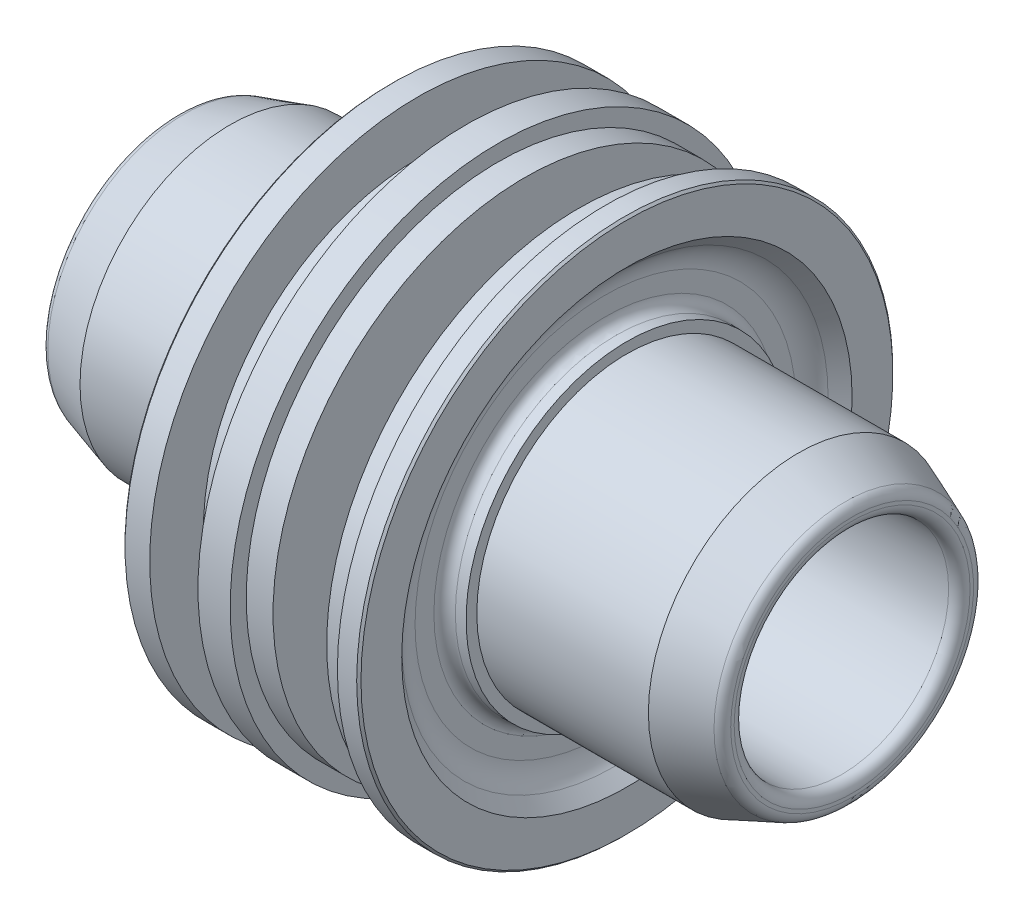
ISO-10303-21;
HEADER;
FILE_DESCRIPTION(('STEP AP214'),'2;1');
FILE_NAME('part.step','',(''),(''),'','','');
FILE_SCHEMA(('AUTOMOTIVE_DESIGN { 1 0 10303 214 1 1 1 1 }'));
ENDSEC;
DATA;
#1=APPLICATION_CONTEXT('core data for automotive mechanical design processes');
#2=APPLICATION_PROTOCOL_DEFINITION('international standard','automotive_design',2000,#1);
#3=PRODUCT_CONTEXT('',#1,'mechanical');
#4=PRODUCT('Part','Part','',(#3));
#5=PRODUCT_RELATED_PRODUCT_CATEGORY('part','',(#4));
#6=PRODUCT_DEFINITION_FORMATION('','',#4);
#7=PRODUCT_DEFINITION_CONTEXT('part definition',#1,'design');
#8=PRODUCT_DEFINITION('design','',#6,#7);
#9=PRODUCT_DEFINITION_SHAPE('','',#8);
#10=(LENGTH_UNIT() NAMED_UNIT(*) SI_UNIT(.MILLI.,.METRE.));
#11=(NAMED_UNIT(*) PLANE_ANGLE_UNIT() SI_UNIT($,.RADIAN.));
#12=(NAMED_UNIT(*) SI_UNIT($,.STERADIAN.) SOLID_ANGLE_UNIT());
#13=UNCERTAINTY_MEASURE_WITH_UNIT(LENGTH_MEASURE(1.E-05),#10,'distance_accuracy_value','');
#14=(GEOMETRIC_REPRESENTATION_CONTEXT(3) GLOBAL_UNCERTAINTY_ASSIGNED_CONTEXT((#13)) GLOBAL_UNIT_ASSIGNED_CONTEXT((#10,
#11,#12)) REPRESENTATION_CONTEXT('',''));
#15=CARTESIAN_POINT('',(0.,0.,0.));
#16=DIRECTION('',(0.,0.,1.));
#17=DIRECTION('',(1.,0.,0.));
#18=AXIS2_PLACEMENT_3D('',#15,#16,#17);
#19=CARTESIAN_POINT('',(25.,14.,0.));
#20=DIRECTION('',(-1.,0.,0.));
#21=DIRECTION('',(0.,0.,1.));
#22=AXIS2_PLACEMENT_3D('',#19,#20,#21);
#23=PLANE('',#22);
#24=CARTESIAN_POINT('',(25.,0.,0.));
#25=DIRECTION('',(-1.,0.,0.));
#26=DIRECTION('',(0.,0.,1.));
#27=AXIS2_PLACEMENT_3D('',#24,#25,#26);
#28=CIRCLE('',#27,14.);
#29=CARTESIAN_POINT('',(25.,0.,14.));
#30=VERTEX_POINT('',#29);
#31=EDGE_CURVE('E133',#30,#30,#28,.T.);
#32=ORIENTED_EDGE('',*,*,#31,.T.);
#33=EDGE_LOOP('',(#32));
#34=FACE_BOUND('',#33,.T.);
#35=CARTESIAN_POINT('',(25.,0.,0.));
#36=DIRECTION('',(1.,0.,0.));
#37=DIRECTION('',(0.,0.,-1.));
#38=AXIS2_PLACEMENT_3D('',#35,#36,#37);
#39=CIRCLE('',#38,15.);
#40=CARTESIAN_POINT('',(25.,0.,-15.));
#41=VERTEX_POINT('',#40);
#42=EDGE_CURVE('E187',#41,#41,#39,.T.);
#43=ORIENTED_EDGE('',*,*,#42,.T.);
#44=EDGE_LOOP('',(#43));
#45=FACE_BOUND('',#44,.T.);
#46=ADVANCED_FACE('F37',(#34,#45),#23,.F.);
#47=CARTESIAN_POINT('',(3.00000000000001,25.,0.));
#48=DIRECTION('',(1.,0.,0.));
#49=DIRECTION('',(0.,0.,-1.));
#50=AXIS2_PLACEMENT_3D('',#47,#48,#49);
#51=PLANE('',#50);
#52=CARTESIAN_POINT('',(3.00000000000001,0.,0.));
#53=DIRECTION('',(1.,0.,0.));
#54=DIRECTION('',(0.,0.,-1.));
#55=AXIS2_PLACEMENT_3D('',#52,#53,#54);
#56=CIRCLE('',#55,15.);
#57=CARTESIAN_POINT('',(3.00000000000001,0.,-15.));
#58=VERTEX_POINT('',#57);
#59=EDGE_CURVE('E142',#58,#58,#56,.T.);
#60=ORIENTED_EDGE('',*,*,#59,.F.);
#61=EDGE_LOOP('',(#60));
#62=FACE_BOUND('',#61,.T.);
#63=CARTESIAN_POINT('',(3.00000000000001,0.,0.));
#64=DIRECTION('',(-1.,0.,0.));
#65=DIRECTION('',(0.,0.,1.));
#66=AXIS2_PLACEMENT_3D('',#63,#64,#65);
#67=CIRCLE('',#66,14.);
#68=CARTESIAN_POINT('',(3.00000000000001,0.,14.));
#69=VERTEX_POINT('',#68);
#70=EDGE_CURVE('E136',#69,#69,#67,.T.);
#71=ORIENTED_EDGE('',*,*,#70,.F.);
#72=EDGE_LOOP('',(#71));
#73=FACE_BOUND('',#72,.T.);
#74=ADVANCED_FACE('F211',(#62,#73),#51,.F.);
#75=CARTESIAN_POINT('',(0.,10.,0.));
#76=DIRECTION('',(1.,0.,0.));
#77=DIRECTION('',(0.,0.,-1.));
#78=AXIS2_PLACEMENT_3D('',#75,#76,#77);
#79=PLANE('',#78);
#80=CARTESIAN_POINT('',(0.,0.,0.));
#81=DIRECTION('',(1.,0.,0.));
#82=DIRECTION('',(0.,0.,-1.));
#83=AXIS2_PLACEMENT_3D('',#80,#81,#82);
#84=CIRCLE('',#83,9.5);
#85=CARTESIAN_POINT('',(0.,0.,-9.5));
#86=VERTEX_POINT('',#85);
#87=EDGE_CURVE('E97',#86,#86,#84,.F.);
#88=ORIENTED_EDGE('',*,*,#87,.T.);
#89=EDGE_LOOP('',(#88));
#90=FACE_BOUND('',#89,.T.);
#91=CARTESIAN_POINT('',(0.,0.,0.));
#92=DIRECTION('',(-1.,0.,0.));
#93=DIRECTION('',(0.,0.,1.));
#94=AXIS2_PLACEMENT_3D('',#91,#92,#93);
#95=CIRCLE('',#94,6.);
#96=CARTESIAN_POINT('',(0.,0.,6.));
#97=VERTEX_POINT('',#96);
#98=EDGE_CURVE('E124',#97,#97,#95,.T.);
#99=ORIENTED_EDGE('',*,*,#98,.F.);
#100=EDGE_LOOP('',(#99));
#101=FACE_BOUND('',#100,.T.);
#102=ADVANCED_FACE('F219',(#90,#101),#79,.F.);
#103=CARTESIAN_POINT('',(-28.280163408719,0.,0.));
#104=DIRECTION('',(-1.,0.,0.));
#105=DIRECTION('',(0.,0.,1.));
#106=AXIS2_PLACEMENT_3D('',#103,#104,#105);
#107=CYLINDRICAL_SURFACE('',#106,6.);
#108=CARTESIAN_POINT('',(21.,0.,0.));
#109=DIRECTION('',(-1.,0.,0.));
#110=DIRECTION('',(0.,0.,1.));
#111=AXIS2_PLACEMENT_3D('',#108,#109,#110);
#112=CIRCLE('',#111,6.);
#113=CARTESIAN_POINT('',(21.,0.,6.));
#114=VERTEX_POINT('',#113);
#115=EDGE_CURVE('E127',#114,#114,#112,.T.);
#116=ORIENTED_EDGE('',*,*,#115,.F.);
#117=EDGE_LOOP('',(#116));
#118=FACE_BOUND('',#117,.T.);
#119=ORIENTED_EDGE('',*,*,#98,.T.);
#120=EDGE_LOOP('',(#119));
#121=FACE_BOUND('',#120,.T.);
#122=ADVANCED_FACE('F590',(#118,#121),#107,.F.);
#123=CARTESIAN_POINT('',(21.,6.,0.));
#124=DIRECTION('',(-1.,0.,0.));
#125=DIRECTION('',(0.,0.,1.));
#126=AXIS2_PLACEMENT_3D('',#123,#124,#125);
#127=PLANE('',#126);
#128=CARTESIAN_POINT('',(21.,0.,0.));
#129=DIRECTION('',(-1.,0.,0.));
#130=DIRECTION('',(0.,0.,1.));
#131=AXIS2_PLACEMENT_3D('',#128,#129,#130);
#132=CIRCLE('',#131,9.5);
#133=CARTESIAN_POINT('',(21.,0.,9.5));
#134=VERTEX_POINT('',#133);
#135=EDGE_CURVE('E88',#134,#134,#132,.F.);
#136=ORIENTED_EDGE('',*,*,#135,.T.);
#137=EDGE_LOOP('',(#136));
#138=FACE_BOUND('',#137,.T.);
#139=ORIENTED_EDGE('',*,*,#115,.T.);
#140=EDGE_LOOP('',(#139));
#141=FACE_BOUND('',#140,.T.);
#142=ADVANCED_FACE('F582',(#138,#141),#127,.F.);
#143=CARTESIAN_POINT('',(-28.280163408719,0.,0.));
#144=DIRECTION('',(-1.,0.,0.));
#145=DIRECTION('',(0.,0.,1.));
#146=AXIS2_PLACEMENT_3D('',#143,#144,#145);
#147=CYLINDRICAL_SURFACE('',#146,10.);
#148=CARTESIAN_POINT('',(21.5,0.,0.));
#149=DIRECTION('',(-1.,0.,0.));
#150=DIRECTION('',(0.,0.,1.));
#151=AXIS2_PLACEMENT_3D('',#148,#149,#150);
#152=CIRCLE('',#151,10.);
#153=CARTESIAN_POINT('',(21.5,0.,10.));
#154=VERTEX_POINT('',#153);
#155=EDGE_CURVE('E91',#154,#154,#152,.T.);
#156=ORIENTED_EDGE('',*,*,#155,.T.);
#157=EDGE_LOOP('',(#156));
#158=FACE_BOUND('',#157,.T.);
#159=CARTESIAN_POINT('',(45.,0.,0.));
#160=DIRECTION('',(-1.,0.,0.));
#161=DIRECTION('',(0.,0.,1.));
#162=AXIS2_PLACEMENT_3D('',#159,#160,#161);
#163=CIRCLE('',#162,10.);
#164=CARTESIAN_POINT('',(45.,0.,10.));
#165=VERTEX_POINT('',#164);
#166=EDGE_CURVE('E100',#165,#165,#163,.F.);
#167=ORIENTED_EDGE('',*,*,#166,.T.);
#168=EDGE_LOOP('',(#167));
#169=FACE_BOUND('',#168,.T.);
#170=ADVANCED_FACE('F575',(#158,#169),#147,.F.);
#171=CARTESIAN_POINT('',(46.,10.,0.));
#172=DIRECTION('',(-1.,0.,0.));
#173=DIRECTION('',(0.,0.,1.));
#174=AXIS2_PLACEMENT_3D('',#171,#172,#173);
#175=PLANE('',#174);
#176=CARTESIAN_POINT('',(46.,0.,0.));
#177=DIRECTION('',(-1.,0.,0.));
#178=DIRECTION('',(0.,0.,1.));
#179=AXIS2_PLACEMENT_3D('',#176,#177,#178);
#180=CIRCLE('',#179,11.3229670385731);
#181=CARTESIAN_POINT('',(46.,0.,11.3229670385731));
#182=VERTEX_POINT('',#181);
#183=EDGE_CURVE('E103',#182,#182,#180,.F.);
#184=ORIENTED_EDGE('',*,*,#183,.T.);
#185=EDGE_LOOP('',(#184));
#186=FACE_BOUND('',#185,.T.);
#187=CARTESIAN_POINT('',(46.,0.,0.));
#188=DIRECTION('',(-1.,0.,0.));
#189=DIRECTION('',(0.,0.,1.));
#190=AXIS2_PLACEMENT_3D('',#187,#188,#189);
#191=CIRCLE('',#190,11.);
#192=CARTESIAN_POINT('',(46.,0.,11.));
#193=VERTEX_POINT('',#192);
#194=EDGE_CURVE('E106',#193,#193,#191,.T.);
#195=ORIENTED_EDGE('',*,*,#194,.T.);
#196=EDGE_LOOP('',(#195));
#197=FACE_BOUND('',#196,.T.);
#198=ADVANCED_FACE('F568',(#186,#197),#175,.F.);
#199=CARTESIAN_POINT('',(46.,0.,0.));
#200=DIRECTION('',(-1.,0.,0.));
#201=DIRECTION('',(0.,0.,1.));
#202=AXIS2_PLACEMENT_3D('',#199,#200,#201);
#203=CONICAL_SURFACE('',#202,12.,0.380506377112365);
#204=CARTESIAN_POINT('',(45.3713906763541,0.,0.));
#205=DIRECTION('',(1.,0.,0.));
#206=DIRECTION('',(0.,0.,-1.));
#207=AXIS2_PLACEMENT_3D('',#204,#205,#206);
#208=CIRCLE('',#207,12.2514437294584);
#209=CARTESIAN_POINT('',(45.3713906763541,0.,-12.2514437294584));
#210=VERTEX_POINT('',#209);
#211=EDGE_CURVE('E109',#210,#210,#208,.F.);
#212=ORIENTED_EDGE('',*,*,#211,.T.);
#213=EDGE_LOOP('',(#212));
#214=FACE_BOUND('',#213,.T.);
#215=CARTESIAN_POINT('',(41.,0.,0.));
#216=DIRECTION('',(-1.,0.,0.));
#217=DIRECTION('',(0.,0.,1.));
#218=AXIS2_PLACEMENT_3D('',#215,#216,#217);
#219=CIRCLE('',#218,14.);
#220=CARTESIAN_POINT('',(41.,0.,14.));
#221=VERTEX_POINT('',#220);
#222=EDGE_CURVE('E130',#221,#221,#219,.T.);
#223=ORIENTED_EDGE('',*,*,#222,.F.);
#224=EDGE_LOOP('',(#223));
#225=FACE_BOUND('',#224,.T.);
#226=ADVANCED_FACE('F561',(#214,#225),#203,.T.);
#227=CARTESIAN_POINT('',(-28.280163408719,0.,0.));
#228=DIRECTION('',(-1.,0.,0.));
#229=DIRECTION('',(0.,0.,1.));
#230=AXIS2_PLACEMENT_3D('',#227,#228,#229);
#231=CYLINDRICAL_SURFACE('',#230,14.);
#232=ORIENTED_EDGE('',*,*,#31,.F.);
#233=EDGE_LOOP('',(#232));
#234=FACE_BOUND('',#233,.T.);
#235=ORIENTED_EDGE('',*,*,#222,.T.);
#236=EDGE_LOOP('',(#235));
#237=FACE_BOUND('',#236,.T.);
#238=ADVANCED_FACE('F312',(#234,#237),#231,.T.);
#239=CARTESIAN_POINT('',(-28.280163408719,0.,0.));
#240=DIRECTION('',(-1.,0.,0.));
#241=DIRECTION('',(0.,0.,1.));
#242=AXIS2_PLACEMENT_3D('',#239,#240,#241);
#243=CYLINDRICAL_SURFACE('',#242,14.);
#244=CARTESIAN_POINT('',(-12.,0.,0.));
#245=DIRECTION('',(-1.,0.,0.));
#246=DIRECTION('',(0.,0.,1.));
#247=AXIS2_PLACEMENT_3D('',#244,#245,#246);
#248=CIRCLE('',#247,14.);
#249=CARTESIAN_POINT('',(-12.,0.,14.));
#250=VERTEX_POINT('',#249);
#251=EDGE_CURVE('E139',#250,#250,#248,.T.);
#252=ORIENTED_EDGE('',*,*,#251,.F.);
#253=EDGE_LOOP('',(#252));
#254=FACE_BOUND('',#253,.T.);
#255=ORIENTED_EDGE('',*,*,#70,.T.);
#256=EDGE_LOOP('',(#255));
#257=FACE_BOUND('',#256,.T.);
#258=ADVANCED_FACE('F309',(#254,#257),#243,.T.);
#259=CARTESIAN_POINT('',(-12.,0.,0.));
#260=DIRECTION('',(1.,0.,0.));
#261=DIRECTION('',(0.,0.,-1.));
#262=AXIS2_PLACEMENT_3D('',#259,#260,#261);
#263=CONICAL_SURFACE('',#262,14.,0.291456794477867);
#264=CARTESIAN_POINT('',(-16.2873478855663,0.,0.));
#265=DIRECTION('',(-1.,0.,0.));
#266=DIRECTION('',(0.,0.,1.));
#267=AXIS2_PLACEMENT_3D('',#264,#265,#266);
#268=CIRCLE('',#267,12.7137956343301);
#269=CARTESIAN_POINT('',(-16.2873478855663,0.,12.7137956343301));
#270=VERTEX_POINT('',#269);
#271=EDGE_CURVE('E115',#270,#270,#268,.F.);
#272=ORIENTED_EDGE('',*,*,#271,.T.);
#273=EDGE_LOOP('',(#272));
#274=FACE_BOUND('',#273,.T.);
#275=ORIENTED_EDGE('',*,*,#251,.T.);
#276=EDGE_LOOP('',(#275));
#277=FACE_BOUND('',#276,.T.);
#278=ADVANCED_FACE('F311',(#274,#277),#263,.T.);
#279=CARTESIAN_POINT('',(-17.,12.5,0.));
#280=DIRECTION('',(1.,0.,0.));
#281=DIRECTION('',(0.,0.,-1.));
#282=AXIS2_PLACEMENT_3D('',#279,#280,#281);
#283=PLANE('',#282);
#284=CARTESIAN_POINT('',(-17.,0.,0.));
#285=DIRECTION('',(1.,0.,0.));
#286=DIRECTION('',(0.,0.,-1.));
#287=AXIS2_PLACEMENT_3D('',#284,#285,#286);
#288=CIRCLE('',#287,11.7559693491089);
#289=CARTESIAN_POINT('',(-17.,0.,-11.7559693491089));
#290=VERTEX_POINT('',#289);
#291=EDGE_CURVE('E118',#290,#290,#288,.F.);
#292=ORIENTED_EDGE('',*,*,#291,.T.);
#293=EDGE_LOOP('',(#292));
#294=FACE_BOUND('',#293,.T.);
#295=CARTESIAN_POINT('',(-17.,0.,0.));
#296=DIRECTION('',(1.,0.,0.));
#297=DIRECTION('',(0.,0.,-1.));
#298=AXIS2_PLACEMENT_3D('',#295,#296,#297);
#299=CIRCLE('',#298,11.);
#300=CARTESIAN_POINT('',(-17.,0.,-11.));
#301=VERTEX_POINT('',#300);
#302=EDGE_CURVE('E121',#301,#301,#299,.T.);
#303=ORIENTED_EDGE('',*,*,#302,.T.);
#304=EDGE_LOOP('',(#303));
#305=FACE_BOUND('',#304,.T.);
#306=ADVANCED_FACE('F316',(#294,#305),#283,.F.);
#307=CARTESIAN_POINT('',(-28.280163408719,0.,0.));
#308=DIRECTION('',(-1.,0.,0.));
#309=DIRECTION('',(0.,0.,1.));
#310=AXIS2_PLACEMENT_3D('',#307,#308,#309);
#311=CYLINDRICAL_SURFACE('',#310,10.);
#312=CARTESIAN_POINT('',(-0.5,0.,0.));
#313=DIRECTION('',(1.,0.,0.));
#314=DIRECTION('',(0.,0.,-1.));
#315=AXIS2_PLACEMENT_3D('',#312,#313,#314);
#316=CIRCLE('',#315,10.);
#317=CARTESIAN_POINT('',(-0.5,0.,-10.));
#318=VERTEX_POINT('',#317);
#319=EDGE_CURVE('E94',#318,#318,#316,.T.);
#320=ORIENTED_EDGE('',*,*,#319,.T.);
#321=EDGE_LOOP('',(#320));
#322=FACE_BOUND('',#321,.T.);
#323=CARTESIAN_POINT('',(-16.,0.,0.));
#324=DIRECTION('',(1.,0.,0.));
#325=DIRECTION('',(0.,0.,-1.));
#326=AXIS2_PLACEMENT_3D('',#323,#324,#325);
#327=CIRCLE('',#326,10.);
#328=CARTESIAN_POINT('',(-16.,0.,-10.));
#329=VERTEX_POINT('',#328);
#330=EDGE_CURVE('E112',#329,#329,#327,.F.);
#331=ORIENTED_EDGE('',*,*,#330,.T.);
#332=EDGE_LOOP('',(#331));
#333=FACE_BOUND('',#332,.T.);
#334=ADVANCED_FACE('F320',(#322,#333),#311,.F.);
#335=CARTESIAN_POINT('',(25.,0.,0.));
#336=DIRECTION('',(1.,0.,0.));
#337=DIRECTION('',(0.,0.,-1.));
#338=AXIS2_PLACEMENT_3D('',#335,#336,#337);
#339=CYLINDRICAL_SURFACE('',#338,15.);
#340=CARTESIAN_POINT('',(9.85698146746236,0.,0.));
#341=DIRECTION('',(1.,0.,0.));
#342=DIRECTION('',(0.,0.,-1.));
#343=AXIS2_PLACEMENT_3D('',#340,#341,#342);
#344=CIRCLE('',#343,15.);
#345=CARTESIAN_POINT('',(9.85698146746236,0.,-15.));
#346=VERTEX_POINT('',#345);
#347=EDGE_CURVE('E58',#346,#346,#344,.F.);
#348=ORIENTED_EDGE('',*,*,#347,.T.);
#349=EDGE_LOOP('',(#348));
#350=FACE_BOUND('',#349,.T.);
#351=ORIENTED_EDGE('',*,*,#59,.T.);
#352=EDGE_LOOP('',(#351));
#353=FACE_BOUND('',#352,.T.);
#354=ADVANCED_FACE('F324',(#350,#353),#339,.T.);
#355=CARTESIAN_POINT('',(10.5,0.,0.));
#356=DIRECTION('',(-1.,0.,0.));
#357=DIRECTION('',(0.,0.,1.));
#358=AXIS2_PLACEMENT_3D('',#355,#356,#357);
#359=CONICAL_SURFACE('',#358,15.,1.32184304977876);
#360=CARTESIAN_POINT('',(10.0014833152142,0.,0.));
#361=DIRECTION('',(-1.,0.,0.));
#362=DIRECTION('',(0.,0.,1.));
#363=AXIS2_PLACEMENT_3D('',#360,#361,#362);
#364=CIRCLE('',#363,16.9609097172133);
#365=CARTESIAN_POINT('',(10.0014833152142,0.,16.9609097172133));
#366=VERTEX_POINT('',#365);
#367=EDGE_CURVE('E61',#366,#366,#364,.T.);
#368=ORIENTED_EDGE('',*,*,#367,.T.);
#369=EDGE_LOOP('',(#368));
#370=FACE_BOUND('',#369,.T.);
#371=CARTESIAN_POINT('',(10.3415668946072,0.,0.));
#372=DIRECTION('',(-1.,0.,0.));
#373=DIRECTION('',(0.,0.,1.));
#374=AXIS2_PLACEMENT_3D('',#371,#372,#373);
#375=CIRCLE('',#374,15.6231948205036);
#376=CARTESIAN_POINT('',(10.3415668946072,0.,15.6231948205036));
#377=VERTEX_POINT('',#376);
#378=EDGE_CURVE('E64',#377,#377,#375,.F.);
#379=ORIENTED_EDGE('',*,*,#378,.T.);
#380=EDGE_LOOP('',(#379));
#381=FACE_BOUND('',#380,.T.);
#382=ADVANCED_FACE('F328',(#370,#381),#359,.F.);
#383=CARTESIAN_POINT('',(9.93465244547025,0.,0.));
#384=DIRECTION('',(-1.,0.,0.));
#385=DIRECTION('',(0.,0.,1.));
#386=AXIS2_PLACEMENT_3D('',#383,#384,#385);
#387=CONICAL_SURFACE('',#386,17.2237881842539,0.327738506780553);
#388=CARTESIAN_POINT('',(8.40098777313008,0.,0.));
#389=DIRECTION('',(-1.,0.,0.));
#390=DIRECTION('',(0.,0.,1.));
#391=AXIS2_PLACEMENT_3D('',#388,#389,#390);
#392=CIRCLE('',#391,17.7452341728495);
#393=CARTESIAN_POINT('',(8.40098777313008,0.,17.7452341728495));
#394=VERTEX_POINT('',#393);
#395=EDGE_CURVE('E67',#394,#394,#392,.T.);
#396=ORIENTED_EDGE('',*,*,#395,.T.);
#397=EDGE_LOOP('',(#396));
#398=FACE_BOUND('',#397,.T.);
#399=CARTESIAN_POINT('',(9.67784925468872,0.,0.));
#400=DIRECTION('',(-1.,0.,0.));
#401=DIRECTION('',(0.,0.,1.));
#402=AXIS2_PLACEMENT_3D('',#399,#400,#401);
#403=CIRCLE('',#402,17.3111012691196);
#404=CARTESIAN_POINT('',(9.67784925468872,0.,17.3111012691196));
#405=VERTEX_POINT('',#404);
#406=EDGE_CURVE('E70',#405,#405,#403,.F.);
#407=ORIENTED_EDGE('',*,*,#406,.T.);
#408=EDGE_LOOP('',(#407));
#409=FACE_BOUND('',#408,.T.);
#410=ADVANCED_FACE('F332',(#398,#409),#387,.F.);
#411=CARTESIAN_POINT('',(8.3332351781665,0.,0.));
#412=DIRECTION('',(-1.,0.,0.));
#413=DIRECTION('',(0.,0.,1.));
#414=AXIS2_PLACEMENT_3D('',#411,#412,#413);
#415=CONICAL_SURFACE('',#414,17.7682700551371,0.0434228518228207);
#416=CARTESIAN_POINT('',(8.26174101009033,0.,0.));
#417=DIRECTION('',(-1.,0.,0.));
#418=DIRECTION('',(0.,0.,1.));
#419=AXIS2_PLACEMENT_3D('',#416,#417,#418);
#420=CIRCLE('',#419,17.7713764884882);
#421=CARTESIAN_POINT('',(8.26174101009033,0.,17.7713764884882));
#422=VERTEX_POINT('',#421);
#423=EDGE_CURVE('E73',#422,#422,#420,.F.);
#424=ORIENTED_EDGE('',*,*,#423,.T.);
#425=EDGE_LOOP('',(#424));
#426=FACE_BOUND('',#425,.T.);
#427=CARTESIAN_POINT('',(3.00000000000001,0.,0.));
#428=DIRECTION('',(1.,0.,0.));
#429=DIRECTION('',(0.,0.,-1.));
#430=AXIS2_PLACEMENT_3D('',#427,#428,#429);
#431=CIRCLE('',#430,18.);
#432=CARTESIAN_POINT('',(3.00000000000001,0.,-18.));
#433=VERTEX_POINT('',#432);
#434=EDGE_CURVE('E145',#433,#433,#431,.T.);
#435=ORIENTED_EDGE('',*,*,#434,.F.);
#436=EDGE_LOOP('',(#435));
#437=FACE_BOUND('',#436,.T.);
#438=ADVANCED_FACE('F207',(#426,#437),#415,.F.);
#439=CARTESIAN_POINT('',(25.,0.,0.));
#440=DIRECTION('',(1.,0.,0.));
#441=DIRECTION('',(0.,0.,-1.));
#442=AXIS2_PLACEMENT_3D('',#439,#440,#441);
#443=CONICAL_SURFACE('',#442,21.,0.785398163397447);
#444=CARTESIAN_POINT('',(23.8786796564404,0.,0.));
#445=DIRECTION('',(1.,0.,0.));
#446=DIRECTION('',(0.,0.,-1.));
#447=AXIS2_PLACEMENT_3D('',#444,#445,#446);
#448=CIRCLE('',#447,19.8786796564404);
#449=CARTESIAN_POINT('',(23.8786796564404,0.,-19.8786796564404));
#450=VERTEX_POINT('',#449);
#451=EDGE_CURVE('E76',#450,#450,#448,.F.);
#452=ORIENTED_EDGE('',*,*,#451,.T.);
#453=EDGE_LOOP('',(#452));
#454=FACE_BOUND('',#453,.T.);
#455=CARTESIAN_POINT('',(25.,0.,0.));
#456=DIRECTION('',(1.,0.,0.));
#457=DIRECTION('',(0.,0.,-1.));
#458=AXIS2_PLACEMENT_3D('',#455,#456,#457);
#459=CIRCLE('',#458,21.);
#460=CARTESIAN_POINT('',(25.,0.,-21.));
#461=VERTEX_POINT('',#460);
#462=EDGE_CURVE('E174',#461,#461,#459,.T.);
#463=ORIENTED_EDGE('',*,*,#462,.T.);
#464=EDGE_LOOP('',(#463));
#465=FACE_BOUND('',#464,.T.);
#466=ADVANCED_FACE('F195',(#454,#465),#443,.F.);
#467=CARTESIAN_POINT('',(25.,0.,0.));
#468=DIRECTION('',(1.,0.,0.));
#469=DIRECTION('',(0.,0.,-1.));
#470=AXIS2_PLACEMENT_3D('',#467,#468,#469);
#471=CYLINDRICAL_SURFACE('',#470,15.);
#472=CARTESIAN_POINT('',(24.,0.,0.));
#473=DIRECTION('',(-1.,0.,0.));
#474=DIRECTION('',(0.,0.,1.));
#475=AXIS2_PLACEMENT_3D('',#472,#473,#474);
#476=CIRCLE('',#475,15.);
#477=CARTESIAN_POINT('',(24.,0.,15.));
#478=VERTEX_POINT('',#477);
#479=EDGE_CURVE('E85',#478,#478,#476,.F.);
#480=ORIENTED_EDGE('',*,*,#479,.T.);
#481=EDGE_LOOP('',(#480));
#482=FACE_BOUND('',#481,.T.);
#483=ORIENTED_EDGE('',*,*,#42,.F.);
#484=EDGE_LOOP('',(#483));
#485=FACE_BOUND('',#484,.T.);
#486=ADVANCED_FACE('F192',(#482,#485),#471,.T.);
#487=CARTESIAN_POINT('',(23.,15.,0.));
#488=DIRECTION('',(-1.,0.,0.));
#489=DIRECTION('',(0.,0.,1.));
#490=AXIS2_PLACEMENT_3D('',#487,#488,#489);
#491=PLANE('',#490);
#492=CARTESIAN_POINT('',(23.,0.,0.));
#493=DIRECTION('',(-1.,0.,0.));
#494=DIRECTION('',(0.,0.,1.));
#495=AXIS2_PLACEMENT_3D('',#492,#493,#494);
#496=CIRCLE('',#495,17.7573593128807);
#497=CARTESIAN_POINT('',(23.,0.,17.7573593128807));
#498=VERTEX_POINT('',#497);
#499=EDGE_CURVE('E79',#498,#498,#496,.F.);
#500=ORIENTED_EDGE('',*,*,#499,.T.);
#501=EDGE_LOOP('',(#500));
#502=FACE_BOUND('',#501,.T.);
#503=CARTESIAN_POINT('',(23.,0.,0.));
#504=DIRECTION('',(-1.,0.,0.));
#505=DIRECTION('',(0.,0.,1.));
#506=AXIS2_PLACEMENT_3D('',#503,#504,#505);
#507=CIRCLE('',#506,16.);
#508=CARTESIAN_POINT('',(23.,0.,16.));
#509=VERTEX_POINT('',#508);
#510=EDGE_CURVE('E82',#509,#509,#507,.T.);
#511=ORIENTED_EDGE('',*,*,#510,.T.);
#512=EDGE_LOOP('',(#511));
#513=FACE_BOUND('',#512,.T.);
#514=ADVANCED_FACE('F194',(#502,#513),#491,.F.);
#515=CARTESIAN_POINT('',(3.00000000000001,0.,0.));
#516=DIRECTION('',(1.,0.,0.));
#517=DIRECTION('',(0.,0.,-1.));
#518=AXIS2_PLACEMENT_3D('',#515,#516,#517);
#519=CIRCLE('',#518,24.8);
#520=CARTESIAN_POINT('',(3.00000000000001,0.,-24.8));
#521=VERTEX_POINT('',#520);
#522=EDGE_CURVE('E45',#521,#521,#519,.F.);
#523=ORIENTED_EDGE('',*,*,#522,.T.);
#524=EDGE_LOOP('',(#523));
#525=FACE_BOUND('',#524,.T.);
#526=ORIENTED_EDGE('',*,*,#434,.T.);
#527=EDGE_LOOP('',(#526));
#528=FACE_BOUND('',#527,.T.);
#529=ADVANCED_FACE('F203',(#525,#528),#51,.F.);
#530=CARTESIAN_POINT('',(-28.280163408719,0.,0.));
#531=DIRECTION('',(-1.,0.,0.));
#532=DIRECTION('',(0.,0.,1.));
#533=AXIS2_PLACEMENT_3D('',#530,#531,#532);
#534=CYLINDRICAL_SURFACE('',#533,25.);
#535=CARTESIAN_POINT('',(3.20000000000003,0.,0.));
#536=DIRECTION('',(1.,0.,0.));
#537=DIRECTION('',(0.,0.,-1.));
#538=AXIS2_PLACEMENT_3D('',#535,#536,#537);
#539=CIRCLE('',#538,25.);
#540=CARTESIAN_POINT('',(3.20000000000003,0.,-25.));
#541=VERTEX_POINT('',#540);
#542=EDGE_CURVE('E10',#541,#541,#539,.T.);
#543=ORIENTED_EDGE('',*,*,#542,.T.);
#544=EDGE_LOOP('',(#543));
#545=FACE_BOUND('',#544,.T.);
#546=CARTESIAN_POINT('',(5.50000000000001,0.,0.));
#547=DIRECTION('',(1.,0.,0.));
#548=DIRECTION('',(0.,0.,-1.));
#549=AXIS2_PLACEMENT_3D('',#546,#547,#548);
#550=CIRCLE('',#549,25.);
#551=CARTESIAN_POINT('',(5.50000000000001,0.,-25.));
#552=VERTEX_POINT('',#551);
#553=EDGE_CURVE('E152',#552,#552,#550,.T.);
#554=ORIENTED_EDGE('',*,*,#553,.F.);
#555=EDGE_LOOP('',(#554));
#556=FACE_BOUND('',#555,.T.);
#557=ADVANCED_FACE('F236',(#545,#556),#534,.T.);
#558=CARTESIAN_POINT('',(24.8,0.,0.));
#559=DIRECTION('',(-1.,0.,0.));
#560=DIRECTION('',(0.,0.,1.));
#561=AXIS2_PLACEMENT_3D('',#558,#559,#560);
#562=CIRCLE('',#561,25.);
#563=CARTESIAN_POINT('',(24.8,0.,25.));
#564=VERTEX_POINT('',#563);
#565=EDGE_CURVE('E53',#564,#564,#562,.T.);
#566=ORIENTED_EDGE('',*,*,#565,.T.);
#567=EDGE_LOOP('',(#566));
#568=FACE_BOUND('',#567,.T.);
#569=CARTESIAN_POINT('',(23.,0.,0.));
#570=DIRECTION('',(1.,0.,0.));
#571=DIRECTION('',(0.,0.,-1.));
#572=AXIS2_PLACEMENT_3D('',#569,#570,#571);
#573=CIRCLE('',#572,25.);
#574=CARTESIAN_POINT('',(23.,0.,-25.));
#575=VERTEX_POINT('',#574);
#576=EDGE_CURVE('E168',#575,#575,#573,.T.);
#577=ORIENTED_EDGE('',*,*,#576,.T.);
#578=EDGE_LOOP('',(#577));
#579=FACE_BOUND('',#578,.T.);
#580=ADVANCED_FACE('F226',(#568,#579),#534,.T.);
#581=CARTESIAN_POINT('',(25.,0.,0.));
#582=DIRECTION('',(-1.,0.,0.));
#583=DIRECTION('',(0.,0.,1.));
#584=AXIS2_PLACEMENT_3D('',#581,#582,#583);
#585=CIRCLE('',#584,24.8);
#586=CARTESIAN_POINT('',(25.,0.,24.8));
#587=VERTEX_POINT('',#586);
#588=EDGE_CURVE('E49',#587,#587,#585,.F.);
#589=ORIENTED_EDGE('',*,*,#588,.T.);
#590=EDGE_LOOP('',(#589));
#591=FACE_BOUND('',#590,.T.);
#592=ORIENTED_EDGE('',*,*,#462,.F.);
#593=EDGE_LOOP('',(#592));
#594=FACE_BOUND('',#593,.T.);
#595=ADVANCED_FACE('F214',(#591,#594),#23,.F.);
#596=CARTESIAN_POINT('',(13.,25.,0.));
#597=DIRECTION('',(-1.,0.,0.));
#598=DIRECTION('',(0.,0.,1.));
#599=AXIS2_PLACEMENT_3D('',#596,#597,#598);
#600=PLANE('',#599);
#601=CARTESIAN_POINT('',(13.,0.,0.));
#602=DIRECTION('',(1.,0.,0.));
#603=DIRECTION('',(0.,0.,-1.));
#604=AXIS2_PLACEMENT_3D('',#601,#602,#603);
#605=CIRCLE('',#604,23.5);
#606=CARTESIAN_POINT('',(13.,0.,-23.5));
#607=VERTEX_POINT('',#606);
#608=EDGE_CURVE('E149',#607,#607,#605,.T.);
#609=ORIENTED_EDGE('',*,*,#608,.F.);
#610=EDGE_LOOP('',(#609));
#611=FACE_BOUND('',#610,.T.);
#612=CARTESIAN_POINT('',(13.,0.,0.));
#613=DIRECTION('',(1.,0.,0.));
#614=DIRECTION('',(0.,0.,-1.));
#615=AXIS2_PLACEMENT_3D('',#612,#613,#614);
#616=CIRCLE('',#615,25.);
#617=CARTESIAN_POINT('',(13.,0.,-25.));
#618=VERTEX_POINT('',#617);
#619=EDGE_CURVE('E171',#618,#618,#616,.T.);
#620=ORIENTED_EDGE('',*,*,#619,.T.);
#621=EDGE_LOOP('',(#620));
#622=FACE_BOUND('',#621,.T.);
#623=ADVANCED_FACE('F225',(#611,#622),#600,.F.);
#624=CARTESIAN_POINT('',(25.,0.,0.));
#625=DIRECTION('',(1.,0.,0.));
#626=DIRECTION('',(0.,0.,-1.));
#627=AXIS2_PLACEMENT_3D('',#624,#625,#626);
#628=CYLINDRICAL_SURFACE('',#627,23.5);
#629=CARTESIAN_POINT('',(15.5,0.,0.));
#630=DIRECTION('',(1.,0.,0.));
#631=DIRECTION('',(0.,0.,-1.));
#632=AXIS2_PLACEMENT_3D('',#629,#630,#631);
#633=CIRCLE('',#632,23.5);
#634=CARTESIAN_POINT('',(15.5,0.,-23.5));
#635=VERTEX_POINT('',#634);
#636=EDGE_CURVE('E153',#635,#635,#633,.T.);
#637=ORIENTED_EDGE('',*,*,#636,.F.);
#638=EDGE_LOOP('',(#637));
#639=FACE_BOUND('',#638,.T.);
#640=ORIENTED_EDGE('',*,*,#608,.T.);
#641=EDGE_LOOP('',(#640));
#642=FACE_BOUND('',#641,.T.);
#643=ADVANCED_FACE('F233',(#639,#642),#628,.T.);
#644=CARTESIAN_POINT('',(15.5,23.5,0.));
#645=DIRECTION('',(-1.,0.,0.));
#646=DIRECTION('',(0.,0.,1.));
#647=AXIS2_PLACEMENT_3D('',#644,#645,#646);
#648=PLANE('',#647);
#649=CARTESIAN_POINT('',(15.5,0.,0.));
#650=DIRECTION('',(1.,0.,0.));
#651=DIRECTION('',(0.,0.,-1.));
#652=AXIS2_PLACEMENT_3D('',#649,#650,#651);
#653=CIRCLE('',#652,15.);
#654=CARTESIAN_POINT('',(15.5,0.,-15.));
#655=VERTEX_POINT('',#654);
#656=EDGE_CURVE('E156',#655,#655,#653,.T.);
#657=ORIENTED_EDGE('',*,*,#656,.F.);
#658=EDGE_LOOP('',(#657));
#659=FACE_BOUND('',#658,.T.);
#660=ORIENTED_EDGE('',*,*,#636,.T.);
#661=EDGE_LOOP('',(#660));
#662=FACE_BOUND('',#661,.T.);
#663=ADVANCED_FACE('F272',(#659,#662),#648,.F.);
#664=CARTESIAN_POINT('',(25.,0.,0.));
#665=DIRECTION('',(1.,0.,0.));
#666=DIRECTION('',(0.,0.,-1.));
#667=AXIS2_PLACEMENT_3D('',#664,#665,#666);
#668=CYLINDRICAL_SURFACE('',#667,15.);
#669=CARTESIAN_POINT('',(20.5,0.,0.));
#670=DIRECTION('',(1.,0.,0.));
#671=DIRECTION('',(0.,0.,-1.));
#672=AXIS2_PLACEMENT_3D('',#669,#670,#671);
#673=CIRCLE('',#672,15.);
#674=CARTESIAN_POINT('',(20.5,0.,-15.));
#675=VERTEX_POINT('',#674);
#676=EDGE_CURVE('E159',#675,#675,#673,.T.);
#677=ORIENTED_EDGE('',*,*,#676,.F.);
#678=EDGE_LOOP('',(#677));
#679=FACE_BOUND('',#678,.T.);
#680=ORIENTED_EDGE('',*,*,#656,.T.);
#681=EDGE_LOOP('',(#680));
#682=FACE_BOUND('',#681,.T.);
#683=ADVANCED_FACE('F266',(#679,#682),#668,.T.);
#684=CARTESIAN_POINT('',(20.5,23.5,0.));
#685=DIRECTION('',(1.,0.,0.));
#686=DIRECTION('',(0.,0.,-1.));
#687=AXIS2_PLACEMENT_3D('',#684,#685,#686);
#688=PLANE('',#687);
#689=CARTESIAN_POINT('',(20.5,0.,0.));
#690=DIRECTION('',(1.,0.,0.));
#691=DIRECTION('',(0.,0.,-1.));
#692=AXIS2_PLACEMENT_3D('',#689,#690,#691);
#693=CIRCLE('',#692,23.5);
#694=CARTESIAN_POINT('',(20.5,0.,-23.5));
#695=VERTEX_POINT('',#694);
#696=EDGE_CURVE('E162',#695,#695,#693,.T.);
#697=ORIENTED_EDGE('',*,*,#696,.F.);
#698=EDGE_LOOP('',(#697));
#699=FACE_BOUND('',#698,.T.);
#700=ORIENTED_EDGE('',*,*,#676,.T.);
#701=EDGE_LOOP('',(#700));
#702=FACE_BOUND('',#701,.T.);
#703=ADVANCED_FACE('F260',(#699,#702),#688,.F.);
#704=CARTESIAN_POINT('',(25.,0.,0.));
#705=DIRECTION('',(1.,0.,0.));
#706=DIRECTION('',(0.,0.,-1.));
#707=AXIS2_PLACEMENT_3D('',#704,#705,#706);
#708=CYLINDRICAL_SURFACE('',#707,23.5);
#709=CARTESIAN_POINT('',(23.,0.,0.));
#710=DIRECTION('',(1.,0.,0.));
#711=DIRECTION('',(0.,0.,-1.));
#712=AXIS2_PLACEMENT_3D('',#709,#710,#711);
#713=CIRCLE('',#712,23.5);
#714=CARTESIAN_POINT('',(23.,0.,-23.5));
#715=VERTEX_POINT('',#714);
#716=EDGE_CURVE('E165',#715,#715,#713,.T.);
#717=ORIENTED_EDGE('',*,*,#716,.F.);
#718=EDGE_LOOP('',(#717));
#719=FACE_BOUND('',#718,.T.);
#720=ORIENTED_EDGE('',*,*,#696,.T.);
#721=EDGE_LOOP('',(#720));
#722=FACE_BOUND('',#721,.T.);
#723=ADVANCED_FACE('F254',(#719,#722),#708,.T.);
#724=CARTESIAN_POINT('',(23.,25.,0.));
#725=DIRECTION('',(1.,0.,0.));
#726=DIRECTION('',(0.,0.,-1.));
#727=AXIS2_PLACEMENT_3D('',#724,#725,#726);
#728=PLANE('',#727);
#729=ORIENTED_EDGE('',*,*,#576,.F.);
#730=EDGE_LOOP('',(#729));
#731=FACE_BOUND('',#730,.T.);
#732=ORIENTED_EDGE('',*,*,#716,.T.);
#733=EDGE_LOOP('',(#732));
#734=FACE_BOUND('',#733,.T.);
#735=ADVANCED_FACE('F251',(#731,#734),#728,.F.);
#736=CARTESIAN_POINT('',(10.,0.,0.));
#737=DIRECTION('',(1.,0.,0.));
#738=DIRECTION('',(0.,0.,-1.));
#739=AXIS2_PLACEMENT_3D('',#736,#737,#738);
#740=CIRCLE('',#739,25.);
#741=CARTESIAN_POINT('',(10.,0.,-25.));
#742=VERTEX_POINT('',#741);
#743=EDGE_CURVE('E180',#742,#742,#740,.T.);
#744=ORIENTED_EDGE('',*,*,#743,.T.);
#745=EDGE_LOOP('',(#744));
#746=FACE_BOUND('',#745,.T.);
#747=ORIENTED_EDGE('',*,*,#619,.F.);
#748=EDGE_LOOP('',(#747));
#749=FACE_BOUND('',#748,.T.);
#750=ADVANCED_FACE('F238',(#746,#749),#534,.T.);
#751=CARTESIAN_POINT('',(5.50000000000001,25.,0.));
#752=DIRECTION('',(-1.,0.,0.));
#753=DIRECTION('',(0.,0.,1.));
#754=AXIS2_PLACEMENT_3D('',#751,#752,#753);
#755=PLANE('',#754);
#756=CARTESIAN_POINT('',(5.50000000000001,0.,0.));
#757=DIRECTION('',(1.,0.,0.));
#758=DIRECTION('',(0.,0.,-1.));
#759=AXIS2_PLACEMENT_3D('',#756,#757,#758);
#760=CIRCLE('',#759,20.);
#761=CARTESIAN_POINT('',(5.50000000000001,0.,-20.));
#762=VERTEX_POINT('',#761);
#763=EDGE_CURVE('E148',#762,#762,#760,.T.);
#764=ORIENTED_EDGE('',*,*,#763,.F.);
#765=EDGE_LOOP('',(#764));
#766=FACE_BOUND('',#765,.T.);
#767=ORIENTED_EDGE('',*,*,#553,.T.);
#768=EDGE_LOOP('',(#767));
#769=FACE_BOUND('',#768,.T.);
#770=ADVANCED_FACE('F289',(#766,#769),#755,.F.);
#771=CARTESIAN_POINT('',(25.,0.,0.));
#772=DIRECTION('',(1.,0.,0.));
#773=DIRECTION('',(0.,0.,-1.));
#774=AXIS2_PLACEMENT_3D('',#771,#772,#773);
#775=CYLINDRICAL_SURFACE('',#774,20.);
#776=CARTESIAN_POINT('',(10.,0.,0.));
#777=DIRECTION('',(1.,0.,0.));
#778=DIRECTION('',(0.,0.,-1.));
#779=AXIS2_PLACEMENT_3D('',#776,#777,#778);
#780=CIRCLE('',#779,20.);
#781=CARTESIAN_POINT('',(10.,0.,-20.));
#782=VERTEX_POINT('',#781);
#783=EDGE_CURVE('E177',#782,#782,#780,.T.);
#784=ORIENTED_EDGE('',*,*,#783,.F.);
#785=EDGE_LOOP('',(#784));
#786=FACE_BOUND('',#785,.T.);
#787=ORIENTED_EDGE('',*,*,#763,.T.);
#788=EDGE_LOOP('',(#787));
#789=FACE_BOUND('',#788,.T.);
#790=ADVANCED_FACE('F294',(#786,#789),#775,.T.);
#791=CARTESIAN_POINT('',(10.,25.,0.));
#792=DIRECTION('',(1.,0.,0.));
#793=DIRECTION('',(0.,0.,-1.));
#794=AXIS2_PLACEMENT_3D('',#791,#792,#793);
#795=PLANE('',#794);
#796=ORIENTED_EDGE('',*,*,#743,.F.);
#797=EDGE_LOOP('',(#796));
#798=FACE_BOUND('',#797,.T.);
#799=ORIENTED_EDGE('',*,*,#783,.T.);
#800=EDGE_LOOP('',(#799));
#801=FACE_BOUND('',#800,.T.);
#802=ADVANCED_FACE('F342',(#798,#801),#795,.F.);
#803=CARTESIAN_POINT('',(-16.,0.,0.));
#804=DIRECTION('',(1.,0.,0.));
#805=DIRECTION('',(0.,0.,-1.));
#806=AXIS2_PLACEMENT_3D('',#803,#804,#805);
#807=TOROIDAL_SURFACE('',#806,11.7559693491089,1.);
#808=ORIENTED_EDGE('',*,*,#271,.F.);
#809=EDGE_LOOP('',(#808));
#810=FACE_BOUND('',#809,.T.);
#811=ORIENTED_EDGE('',*,*,#291,.F.);
#812=EDGE_LOOP('',(#811));
#813=FACE_BOUND('',#812,.T.);
#814=ADVANCED_FACE('F345',(#810,#813),#807,.T.);
#815=CARTESIAN_POINT('',(-16.,0.,0.));
#816=DIRECTION('',(1.,0.,0.));
#817=DIRECTION('',(0.,0.,-1.));
#818=AXIS2_PLACEMENT_3D('',#815,#816,#817);
#819=TOROIDAL_SURFACE('',#818,11.,1.);
#820=ORIENTED_EDGE('',*,*,#302,.F.);
#821=EDGE_LOOP('',(#820));
#822=FACE_BOUND('',#821,.T.);
#823=ORIENTED_EDGE('',*,*,#330,.F.);
#824=EDGE_LOOP('',(#823));
#825=FACE_BOUND('',#824,.T.);
#826=ADVANCED_FACE('F351',(#822,#825),#819,.T.);
#827=CARTESIAN_POINT('',(45.,0.,0.));
#828=DIRECTION('',(-1.,0.,0.));
#829=DIRECTION('',(0.,0.,1.));
#830=AXIS2_PLACEMENT_3D('',#827,#828,#829);
#831=TOROIDAL_SURFACE('',#830,11.3229670385731,1.);
#832=ORIENTED_EDGE('',*,*,#183,.F.);
#833=EDGE_LOOP('',(#832));
#834=FACE_BOUND('',#833,.T.);
#835=ORIENTED_EDGE('',*,*,#211,.F.);
#836=EDGE_LOOP('',(#835));
#837=FACE_BOUND('',#836,.T.);
#838=ADVANCED_FACE('F362',(#834,#837),#831,.T.);
#839=CARTESIAN_POINT('',(45.,0.,0.));
#840=DIRECTION('',(-1.,0.,0.));
#841=DIRECTION('',(0.,0.,1.));
#842=AXIS2_PLACEMENT_3D('',#839,#840,#841);
#843=TOROIDAL_SURFACE('',#842,11.,1.);
#844=ORIENTED_EDGE('',*,*,#166,.F.);
#845=EDGE_LOOP('',(#844));
#846=FACE_BOUND('',#845,.T.);
#847=ORIENTED_EDGE('',*,*,#194,.F.);
#848=EDGE_LOOP('',(#847));
#849=FACE_BOUND('',#848,.T.);
#850=ADVANCED_FACE('F372',(#846,#849),#843,.T.);
#851=CARTESIAN_POINT('',(-0.5,0.,0.));
#852=DIRECTION('',(1.,0.,0.));
#853=DIRECTION('',(0.,0.,-1.));
#854=AXIS2_PLACEMENT_3D('',#851,#852,#853);
#855=TOROIDAL_SURFACE('',#854,9.5,0.5);
#856=ORIENTED_EDGE('',*,*,#319,.F.);
#857=EDGE_LOOP('',(#856));
#858=FACE_BOUND('',#857,.T.);
#859=ORIENTED_EDGE('',*,*,#87,.F.);
#860=EDGE_LOOP('',(#859));
#861=FACE_BOUND('',#860,.T.);
#862=ADVANCED_FACE('F376',(#858,#861),#855,.F.);
#863=CARTESIAN_POINT('',(21.5,0.,0.));
#864=DIRECTION('',(-1.,0.,0.));
#865=DIRECTION('',(0.,0.,1.));
#866=AXIS2_PLACEMENT_3D('',#863,#864,#865);
#867=TOROIDAL_SURFACE('',#866,9.5,0.5);
#868=ORIENTED_EDGE('',*,*,#135,.F.);
#869=EDGE_LOOP('',(#868));
#870=FACE_BOUND('',#869,.T.);
#871=ORIENTED_EDGE('',*,*,#155,.F.);
#872=EDGE_LOOP('',(#871));
#873=FACE_BOUND('',#872,.T.);
#874=ADVANCED_FACE('F380',(#870,#873),#867,.F.);
#875=CARTESIAN_POINT('',(24.,0.,0.));
#876=DIRECTION('',(-1.,0.,0.));
#877=DIRECTION('',(0.,0.,1.));
#878=AXIS2_PLACEMENT_3D('',#875,#876,#877);
#879=TOROIDAL_SURFACE('',#878,16.,1.);
#880=ORIENTED_EDGE('',*,*,#510,.F.);
#881=EDGE_LOOP('',(#880));
#882=FACE_BOUND('',#881,.T.);
#883=ORIENTED_EDGE('',*,*,#479,.F.);
#884=EDGE_LOOP('',(#883));
#885=FACE_BOUND('',#884,.T.);
#886=ADVANCED_FACE('F383',(#882,#885),#879,.F.);
#887=CARTESIAN_POINT('',(26.,0.,0.));
#888=DIRECTION('',(-1.,0.,0.));
#889=DIRECTION('',(0.,0.,1.));
#890=AXIS2_PLACEMENT_3D('',#887,#888,#889);
#891=TOROIDAL_SURFACE('',#890,17.7573593128807,3.);
#892=ORIENTED_EDGE('',*,*,#451,.F.);
#893=EDGE_LOOP('',(#892));
#894=FACE_BOUND('',#893,.T.);
#895=ORIENTED_EDGE('',*,*,#499,.F.);
#896=EDGE_LOOP('',(#895));
#897=FACE_BOUND('',#896,.T.);
#898=ADVANCED_FACE('F386',(#894,#897),#891,.F.);
#899=CARTESIAN_POINT('',(8.24003640651073,0.,0.));
#900=DIRECTION('',(1.,0.,0.));
#901=DIRECTION('',(0.,0.,-1.));
#902=AXIS2_PLACEMENT_3D('',#899,#900,#901);
#903=TOROIDAL_SURFACE('',#902,17.2718478004397,0.5);
#904=ORIENTED_EDGE('',*,*,#395,.F.);
#905=EDGE_LOOP('',(#904));
#906=FACE_BOUND('',#905,.T.);
#907=ORIENTED_EDGE('',*,*,#423,.F.);
#908=EDGE_LOOP('',(#907));
#909=FACE_BOUND('',#908,.T.);
#910=ADVANCED_FACE('F390',(#906,#909),#903,.F.);
#911=CARTESIAN_POINT('',(9.51689788806937,0.,0.));
#912=DIRECTION('',(1.,0.,0.));
#913=DIRECTION('',(0.,0.,-1.));
#914=AXIS2_PLACEMENT_3D('',#911,#912,#913);
#915=TOROIDAL_SURFACE('',#914,16.8377148967097,0.5);
#916=ORIENTED_EDGE('',*,*,#367,.F.);
#917=EDGE_LOOP('',(#916));
#918=FACE_BOUND('',#917,.T.);
#919=ORIENTED_EDGE('',*,*,#406,.F.);
#920=EDGE_LOOP('',(#919));
#921=FACE_BOUND('',#920,.T.);
#922=ADVANCED_FACE('F394',(#918,#921),#915,.F.);
#923=CARTESIAN_POINT('',(9.85698146746236,0.,0.));
#924=DIRECTION('',(1.,0.,0.));
#925=DIRECTION('',(0.,0.,-1.));
#926=AXIS2_PLACEMENT_3D('',#923,#924,#925);
#927=TOROIDAL_SURFACE('',#926,15.5,0.5);
#928=ORIENTED_EDGE('',*,*,#347,.F.);
#929=EDGE_LOOP('',(#928));
#930=FACE_BOUND('',#929,.T.);
#931=ORIENTED_EDGE('',*,*,#378,.F.);
#932=EDGE_LOOP('',(#931));
#933=FACE_BOUND('',#932,.T.);
#934=ADVANCED_FACE('F246',(#930,#933),#927,.F.);
#935=CARTESIAN_POINT('',(24.8,0.,0.));
#936=DIRECTION('',(-1.,0.,0.));
#937=DIRECTION('',(0.,0.,1.));
#938=AXIS2_PLACEMENT_3D('',#935,#936,#937);
#939=CONICAL_SURFACE('',#938,25.,0.785398163397431);
#940=ORIENTED_EDGE('',*,*,#588,.F.);
#941=EDGE_LOOP('',(#940));
#942=FACE_BOUND('',#941,.T.);
#943=ORIENTED_EDGE('',*,*,#565,.F.);
#944=EDGE_LOOP('',(#943));
#945=FACE_BOUND('',#944,.T.);
#946=ADVANCED_FACE('F244',(#942,#945),#939,.T.);
#947=CARTESIAN_POINT('',(3.00000000000001,0.,0.));
#948=DIRECTION('',(1.,0.,0.));
#949=DIRECTION('',(0.,0.,-1.));
#950=AXIS2_PLACEMENT_3D('',#947,#948,#949);
#951=CONICAL_SURFACE('',#950,24.8,0.785398163397466);
#952=ORIENTED_EDGE('',*,*,#542,.F.);
#953=EDGE_LOOP('',(#952));
#954=FACE_BOUND('',#953,.T.);
#955=ORIENTED_EDGE('',*,*,#522,.F.);
#956=EDGE_LOOP('',(#955));
#957=FACE_BOUND('',#956,.T.);
#958=ADVANCED_FACE('F40',(#954,#957),#951,.T.);
#959=CLOSED_SHELL('',(#46,#74,#102,#122,#142,#170,#198,#226,#238,#258,#278,#306,#334,#354,#382,
#410,#438,#466,#486,#514,#529,#557,#580,#595,#623,#643,#663,#683,#703,#723,#735,#750,#770,#790,
#802,#814,#826,#838,#850,#862,#874,#886,#898,#910,#922,#934,#946,#958));
#960=MANIFOLD_SOLID_BREP('B2',#959);
#961=ADVANCED_BREP_SHAPE_REPRESENTATION('',(#18,#960),#14);
#962=SHAPE_DEFINITION_REPRESENTATION(#9,#961);
ENDSEC;
END-ISO-10303-21;
